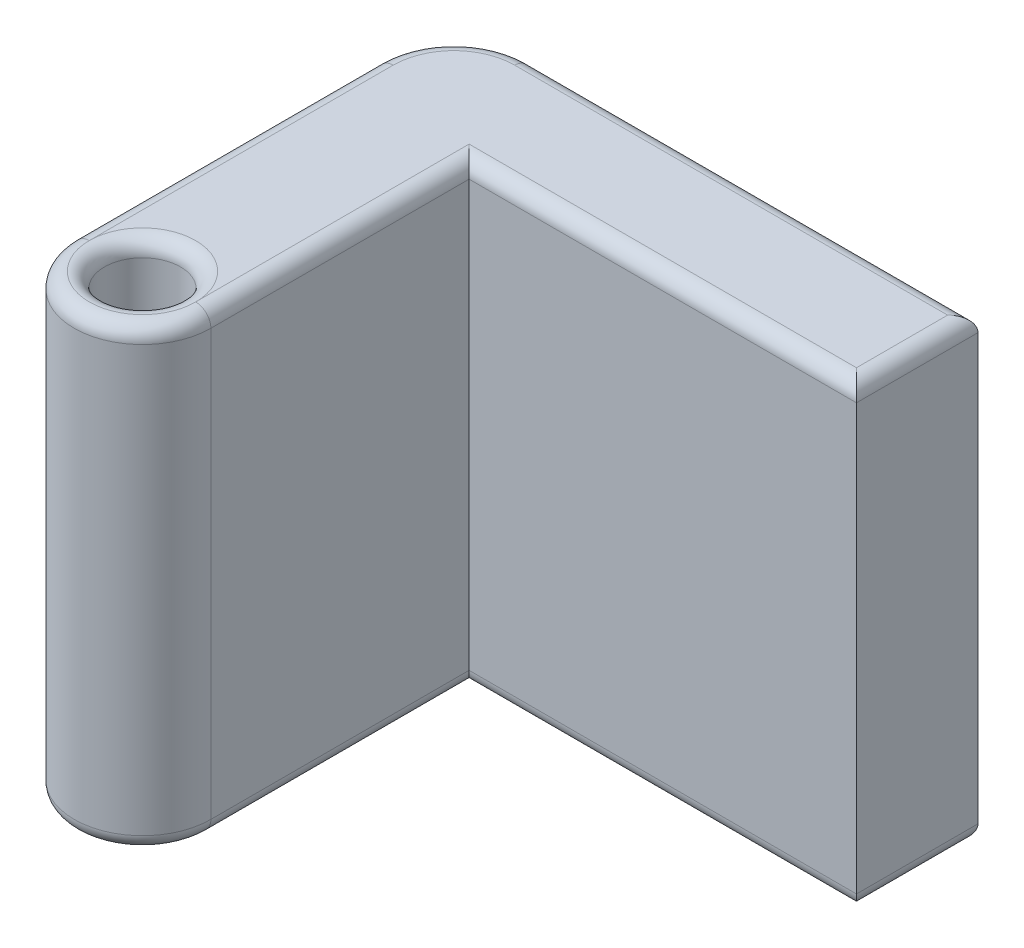
ISO-10303-21;
HEADER;
FILE_DESCRIPTION(('STEP AP214'),'2;1');
FILE_NAME('part.step','',(''),(''),'','','');
FILE_SCHEMA(('AUTOMOTIVE_DESIGN { 1 0 10303 214 1 1 1 1 }'));
ENDSEC;
DATA;
#1=APPLICATION_CONTEXT('core data for automotive mechanical design processes');
#2=APPLICATION_PROTOCOL_DEFINITION('international standard','automotive_design',2000,#1);
#3=PRODUCT_CONTEXT('',#1,'mechanical');
#4=PRODUCT('Part','Part','',(#3));
#5=PRODUCT_RELATED_PRODUCT_CATEGORY('part','',(#4));
#6=PRODUCT_DEFINITION_FORMATION('','',#4);
#7=PRODUCT_DEFINITION_CONTEXT('part definition',#1,'design');
#8=PRODUCT_DEFINITION('design','',#6,#7);
#9=PRODUCT_DEFINITION_SHAPE('','',#8);
#10=(LENGTH_UNIT() NAMED_UNIT(*) SI_UNIT(.MILLI.,.METRE.));
#11=(NAMED_UNIT(*) PLANE_ANGLE_UNIT() SI_UNIT($,.RADIAN.));
#12=(NAMED_UNIT(*) SI_UNIT($,.STERADIAN.) SOLID_ANGLE_UNIT());
#13=UNCERTAINTY_MEASURE_WITH_UNIT(LENGTH_MEASURE(1.E-05),#10,'distance_accuracy_value','');
#14=(GEOMETRIC_REPRESENTATION_CONTEXT(3) GLOBAL_UNCERTAINTY_ASSIGNED_CONTEXT((#13)) GLOBAL_UNIT_ASSIGNED_CONTEXT((#10,
#11,#12)) REPRESENTATION_CONTEXT('',''));
#15=CARTESIAN_POINT('',(0.,0.,0.));
#16=DIRECTION('',(0.,0.,1.));
#17=DIRECTION('',(1.,0.,0.));
#18=AXIS2_PLACEMENT_3D('',#15,#16,#17);
#19=CARTESIAN_POINT('',(-30.,30.,25.));
#20=DIRECTION('',(0.,1.,0.));
#21=DIRECTION('',(0.,0.,1.));
#22=AXIS2_PLACEMENT_3D('',#19,#20,#21);
#23=PLANE('',#22);
#24=CARTESIAN_POINT('',(-29.5,30.,5.));
#25=DIRECTION('',(0.,1.,0.));
#26=DIRECTION('',(0.,0.,1.));
#27=AXIS2_PLACEMENT_3D('',#24,#25,#26);
#28=CIRCLE('',#27,4.);
#29=CARTESIAN_POINT('',(-33.5,30.,5.));
#30=VERTEX_POINT('',#29);
#31=CARTESIAN_POINT('',(-29.5,30.,1.));
#32=VERTEX_POINT('',#31);
#33=EDGE_CURVE('E218',#30,#32,#28,.F.);
#34=ORIENTED_EDGE('',*,*,#33,.F.);
#35=DIRECTION('',(0.,0.,1.));
#36=VECTOR('',#35,1.);
#37=CARTESIAN_POINT('',(-33.5,30.,25.));
#38=LINE('',#37,#36);
#39=CARTESIAN_POINT('',(-33.5,30.,25.));
#40=VERTEX_POINT('',#39);
#41=EDGE_CURVE('E254',#30,#40,#38,.T.);
#42=ORIENTED_EDGE('',*,*,#41,.T.);
#43=CARTESIAN_POINT('',(-30.,30.,25.));
#44=DIRECTION('',(0.,1.,0.));
#45=DIRECTION('',(0.,0.,1.));
#46=AXIS2_PLACEMENT_3D('',#43,#44,#45);
#47=CIRCLE('',#46,3.5);
#48=CARTESIAN_POINT('',(-26.5,30.,25.));
#49=VERTEX_POINT('',#48);
#50=EDGE_CURVE('E266',#40,#49,#47,.F.);
#51=ORIENTED_EDGE('',*,*,#50,.T.);
#52=DIRECTION('',(0.,0.,-1.));
#53=VECTOR('',#52,1.);
#54=CARTESIAN_POINT('',(-26.5,30.,8.));
#55=LINE('',#54,#53);
#56=CARTESIAN_POINT('',(-26.5,30.,7.));
#57=VERTEX_POINT('',#56);
#58=EDGE_CURVE('E212',#49,#57,#55,.T.);
#59=ORIENTED_EDGE('',*,*,#58,.T.);
#60=DIRECTION('',(1.,0.,0.));
#61=VECTOR('',#60,1.);
#62=CARTESIAN_POINT('',(0.,30.,7.));
#63=LINE('',#62,#61);
#64=CARTESIAN_POINT('',(-1.,30.,7.));
#65=VERTEX_POINT('',#64);
#66=EDGE_CURVE('E258',#57,#65,#63,.T.);
#67=ORIENTED_EDGE('',*,*,#66,.T.);
#68=DIRECTION('',(0.,0.,-1.));
#69=VECTOR('',#68,1.);
#70=CARTESIAN_POINT('',(-1.,30.,0.));
#71=LINE('',#70,#69);
#72=CARTESIAN_POINT('',(-1.,30.,1.));
#73=VERTEX_POINT('',#72);
#74=EDGE_CURVE('E251',#65,#73,#71,.T.);
#75=ORIENTED_EDGE('',*,*,#74,.T.);
#76=DIRECTION('',(-1.,0.,0.));
#77=VECTOR('',#76,1.);
#78=CARTESIAN_POINT('',(-34.5,30.,1.00000000000001));
#79=LINE('',#78,#77);
#80=EDGE_CURVE('E247',#73,#32,#79,.T.);
#81=ORIENTED_EDGE('',*,*,#80,.T.);
#82=EDGE_LOOP('',(#34,#42,#51,#59,#67,#75,#81));
#83=FACE_BOUND('',#82,.T.);
#84=ADVANCED_FACE('F41',(#83),#23,.T.);
#85=CARTESIAN_POINT('',(-30.,0.,25.));
#86=DIRECTION('',(0.,1.,0.));
#87=DIRECTION('',(0.,0.,1.));
#88=AXIS2_PLACEMENT_3D('',#85,#86,#87);
#89=PLANE('',#88);
#90=CARTESIAN_POINT('',(-29.5,0.,5.));
#91=DIRECTION('',(0.,1.,0.));
#92=DIRECTION('',(0.,0.,1.));
#93=AXIS2_PLACEMENT_3D('',#90,#91,#92);
#94=CIRCLE('',#93,4.);
#95=CARTESIAN_POINT('',(-29.5,0.,1.));
#96=VERTEX_POINT('',#95);
#97=CARTESIAN_POINT('',(-33.5,0.,5.));
#98=VERTEX_POINT('',#97);
#99=EDGE_CURVE('E153',#96,#98,#94,.T.);
#100=ORIENTED_EDGE('',*,*,#99,.F.);
#101=DIRECTION('',(-1.,0.,0.));
#102=VECTOR('',#101,1.);
#103=CARTESIAN_POINT('',(-30.,0.,1.));
#104=LINE('',#103,#102);
#105=CARTESIAN_POINT('',(-1.,0.,1.));
#106=VERTEX_POINT('',#105);
#107=EDGE_CURVE('E146',#96,#106,#104,.F.);
#108=ORIENTED_EDGE('',*,*,#107,.T.);
#109=DIRECTION('',(0.,0.,-1.));
#110=VECTOR('',#109,1.);
#111=CARTESIAN_POINT('',(-1.,0.,25.));
#112=LINE('',#111,#110);
#113=CARTESIAN_POINT('',(-1.,0.,7.));
#114=VERTEX_POINT('',#113);
#115=EDGE_CURVE('E149',#106,#114,#112,.F.);
#116=ORIENTED_EDGE('',*,*,#115,.T.);
#117=DIRECTION('',(1.,0.,0.));
#118=VECTOR('',#117,1.);
#119=CARTESIAN_POINT('',(-30.,0.,7.));
#120=LINE('',#119,#118);
#121=CARTESIAN_POINT('',(-26.5,0.,7.));
#122=VERTEX_POINT('',#121);
#123=EDGE_CURVE('E168',#114,#122,#120,.F.);
#124=ORIENTED_EDGE('',*,*,#123,.T.);
#125=DIRECTION('',(0.,0.,-1.));
#126=VECTOR('',#125,1.);
#127=CARTESIAN_POINT('',(-26.5,0.,25.));
#128=LINE('',#127,#126);
#129=CARTESIAN_POINT('',(-26.5,0.,25.));
#130=VERTEX_POINT('',#129);
#131=EDGE_CURVE('E157',#122,#130,#128,.F.);
#132=ORIENTED_EDGE('',*,*,#131,.T.);
#133=CARTESIAN_POINT('',(-30.,0.,25.));
#134=DIRECTION('',(0.,1.,0.));
#135=DIRECTION('',(0.,0.,1.));
#136=AXIS2_PLACEMENT_3D('',#133,#134,#135);
#137=CIRCLE('',#136,3.5);
#138=CARTESIAN_POINT('',(-33.5,0.,25.));
#139=VERTEX_POINT('',#138);
#140=EDGE_CURVE('E156',#130,#139,#137,.T.);
#141=ORIENTED_EDGE('',*,*,#140,.T.);
#142=DIRECTION('',(0.,0.,1.));
#143=VECTOR('',#142,1.);
#144=CARTESIAN_POINT('',(-33.5,0.,25.));
#145=LINE('',#144,#143);
#146=EDGE_CURVE('E331',#139,#98,#145,.F.);
#147=ORIENTED_EDGE('',*,*,#146,.T.);
#148=EDGE_LOOP('',(#100,#108,#116,#124,#132,#141,#147));
#149=FACE_BOUND('',#148,.T.);
#150=ADVANCED_FACE('F148',(#149),#89,.F.);
#151=CARTESIAN_POINT('',(0.,30.,8.));
#152=DIRECTION('',(-1.,0.,0.));
#153=DIRECTION('',(0.,0.,1.));
#154=AXIS2_PLACEMENT_3D('',#151,#152,#153);
#155=PLANE('',#154);
#156=DIRECTION('',(0.,-1.,0.));
#157=VECTOR('',#156,1.);
#158=CARTESIAN_POINT('',(0.,30.,8.));
#159=LINE('',#158,#157);
#160=CARTESIAN_POINT('',(0.,29.,8.));
#161=VERTEX_POINT('',#160);
#162=CARTESIAN_POINT('',(0.,1.,8.));
#163=VERTEX_POINT('',#162);
#164=EDGE_CURVE('E174',#161,#163,#159,.T.);
#165=ORIENTED_EDGE('',*,*,#164,.T.);
#166=DIRECTION('',(0.,0.,-1.));
#167=VECTOR('',#166,1.);
#168=CARTESIAN_POINT('',(0.,1.,8.));
#169=LINE('',#168,#167);
#170=CARTESIAN_POINT('',(0.,1.,0.));
#171=VERTEX_POINT('',#170);
#172=EDGE_CURVE('E260',#163,#171,#169,.T.);
#173=ORIENTED_EDGE('',*,*,#172,.T.);
#174=DIRECTION('',(0.,-1.,0.));
#175=VECTOR('',#174,1.);
#176=CARTESIAN_POINT('',(0.,30.,0.));
#177=LINE('',#176,#175);
#178=CARTESIAN_POINT('',(0.,29.,0.));
#179=VERTEX_POINT('',#178);
#180=EDGE_CURVE('E169',#179,#171,#177,.T.);
#181=ORIENTED_EDGE('',*,*,#180,.F.);
#182=DIRECTION('',(0.,0.,-1.));
#183=VECTOR('',#182,1.);
#184=CARTESIAN_POINT('',(0.,29.,8.));
#185=LINE('',#184,#183);
#186=EDGE_CURVE('E298',#179,#161,#185,.F.);
#187=ORIENTED_EDGE('',*,*,#186,.T.);
#188=EDGE_LOOP('',(#165,#173,#181,#187));
#189=FACE_BOUND('',#188,.T.);
#190=ADVANCED_FACE('F311',(#189),#155,.F.);
#191=CARTESIAN_POINT('',(0.,30.,0.));
#192=DIRECTION('',(0.,0.,1.));
#193=DIRECTION('',(1.,0.,0.));
#194=AXIS2_PLACEMENT_3D('',#191,#192,#193);
#195=PLANE('',#194);
#196=DIRECTION('',(-1.,0.,0.));
#197=VECTOR('',#196,1.);
#198=CARTESIAN_POINT('',(0.,1.,0.));
#199=LINE('',#198,#197);
#200=CARTESIAN_POINT('',(-29.5,1.,0.));
#201=VERTEX_POINT('',#200);
#202=EDGE_CURVE('E172',#171,#201,#199,.T.);
#203=ORIENTED_EDGE('',*,*,#202,.T.);
#204=DIRECTION('',(0.,-1.,0.));
#205=VECTOR('',#204,1.);
#206=CARTESIAN_POINT('',(-29.5,30.,0.));
#207=LINE('',#206,#205);
#208=CARTESIAN_POINT('',(-29.5,29.,0.));
#209=VERTEX_POINT('',#208);
#210=EDGE_CURVE('E11',#201,#209,#207,.F.);
#211=ORIENTED_EDGE('',*,*,#210,.T.);
#212=DIRECTION('',(-1.,0.,0.));
#213=VECTOR('',#212,1.);
#214=CARTESIAN_POINT('',(0.,29.,0.));
#215=LINE('',#214,#213);
#216=EDGE_CURVE('E248',#209,#179,#215,.F.);
#217=ORIENTED_EDGE('',*,*,#216,.T.);
#218=ORIENTED_EDGE('',*,*,#180,.T.);
#219=EDGE_LOOP('',(#203,#211,#217,#218));
#220=FACE_BOUND('',#219,.T.);
#221=ADVANCED_FACE('F314',(#220),#195,.F.);
#222=CARTESIAN_POINT('',(-34.5,30.,0.));
#223=DIRECTION('',(1.,0.,0.));
#224=DIRECTION('',(0.,0.,-1.));
#225=AXIS2_PLACEMENT_3D('',#222,#223,#224);
#226=PLANE('',#225);
#227=DIRECTION('',(0.,0.,1.));
#228=VECTOR('',#227,1.);
#229=CARTESIAN_POINT('',(-34.5,29.,0.));
#230=LINE('',#229,#228);
#231=CARTESIAN_POINT('',(-34.5,29.,25.));
#232=VERTEX_POINT('',#231);
#233=CARTESIAN_POINT('',(-34.5,29.,5.));
#234=VERTEX_POINT('',#233);
#235=EDGE_CURVE('E346',#232,#234,#230,.F.);
#236=ORIENTED_EDGE('',*,*,#235,.T.);
#237=DIRECTION('',(0.,-1.,0.));
#238=VECTOR('',#237,1.);
#239=CARTESIAN_POINT('',(-34.5,30.,5.));
#240=LINE('',#239,#238);
#241=CARTESIAN_POINT('',(-34.5,1.,5.));
#242=VERTEX_POINT('',#241);
#243=EDGE_CURVE('E51',#234,#242,#240,.T.);
#244=ORIENTED_EDGE('',*,*,#243,.T.);
#245=DIRECTION('',(0.,0.,1.));
#246=VECTOR('',#245,1.);
#247=CARTESIAN_POINT('',(-34.5,1.,0.));
#248=LINE('',#247,#246);
#249=CARTESIAN_POINT('',(-34.5,1.,25.));
#250=VERTEX_POINT('',#249);
#251=EDGE_CURVE('E349',#242,#250,#248,.T.);
#252=ORIENTED_EDGE('',*,*,#251,.T.);
#253=DIRECTION('',(0.,-1.,0.));
#254=VECTOR('',#253,1.);
#255=CARTESIAN_POINT('',(-34.5,30.,25.));
#256=LINE('',#255,#254);
#257=EDGE_CURVE('E316',#232,#250,#256,.T.);
#258=ORIENTED_EDGE('',*,*,#257,.F.);
#259=EDGE_LOOP('',(#236,#244,#252,#258));
#260=FACE_BOUND('',#259,.T.);
#261=ADVANCED_FACE('F398',(#260),#226,.F.);
#262=CARTESIAN_POINT('',(-30.,30.,25.));
#263=DIRECTION('',(0.,-1.,0.));
#264=DIRECTION('',(0.,0.,-1.));
#265=AXIS2_PLACEMENT_3D('',#262,#263,#264);
#266=CYLINDRICAL_SURFACE('',#265,4.5);
#267=ORIENTED_EDGE('',*,*,#257,.T.);
#268=CARTESIAN_POINT('',(-30.,1.,25.));
#269=DIRECTION('',(0.,1.,0.));
#270=DIRECTION('',(0.,0.,1.));
#271=AXIS2_PLACEMENT_3D('',#268,#269,#270);
#272=CIRCLE('',#271,4.5);
#273=CARTESIAN_POINT('',(-25.5,1.,25.));
#274=VERTEX_POINT('',#273);
#275=EDGE_CURVE('E355',#250,#274,#272,.T.);
#276=ORIENTED_EDGE('',*,*,#275,.T.);
#277=DIRECTION('',(0.,-1.,0.));
#278=VECTOR('',#277,1.);
#279=CARTESIAN_POINT('',(-25.5,30.,25.));
#280=LINE('',#279,#278);
#281=CARTESIAN_POINT('',(-25.5,29.,25.));
#282=VERTEX_POINT('',#281);
#283=EDGE_CURVE('E320',#282,#274,#280,.T.);
#284=ORIENTED_EDGE('',*,*,#283,.F.);
#285=CARTESIAN_POINT('',(-30.,29.,25.));
#286=DIRECTION('',(0.,1.,0.));
#287=DIRECTION('',(0.,0.,1.));
#288=AXIS2_PLACEMENT_3D('',#285,#286,#287);
#289=CIRCLE('',#288,4.5);
#290=EDGE_CURVE('E352',#282,#232,#289,.F.);
#291=ORIENTED_EDGE('',*,*,#290,.T.);
#292=EDGE_LOOP('',(#267,#276,#284,#291));
#293=FACE_BOUND('',#292,.T.);
#294=ADVANCED_FACE('F382',(#293),#266,.T.);
#295=CARTESIAN_POINT('',(-25.5,30.,25.));
#296=DIRECTION('',(-1.,0.,0.));
#297=DIRECTION('',(0.,0.,1.));
#298=AXIS2_PLACEMENT_3D('',#295,#296,#297);
#299=PLANE('',#298);
#300=ORIENTED_EDGE('',*,*,#283,.T.);
#301=DIRECTION('',(0.,0.,-1.));
#302=VECTOR('',#301,1.);
#303=CARTESIAN_POINT('',(-25.5,1.,25.));
#304=LINE('',#303,#302);
#305=CARTESIAN_POINT('',(-25.5,1.,8.));
#306=VERTEX_POINT('',#305);
#307=EDGE_CURVE('E289',#274,#306,#304,.T.);
#308=ORIENTED_EDGE('',*,*,#307,.T.);
#309=DIRECTION('',(0.,-1.,0.));
#310=VECTOR('',#309,1.);
#311=CARTESIAN_POINT('',(-25.5,30.,8.));
#312=LINE('',#311,#310);
#313=CARTESIAN_POINT('',(-25.5,29.,8.));
#314=VERTEX_POINT('',#313);
#315=EDGE_CURVE('E179',#314,#306,#312,.T.);
#316=ORIENTED_EDGE('',*,*,#315,.F.);
#317=DIRECTION('',(0.,0.,-1.));
#318=VECTOR('',#317,1.);
#319=CARTESIAN_POINT('',(-25.5,29.,25.));
#320=LINE('',#319,#318);
#321=EDGE_CURVE('E358',#314,#282,#320,.F.);
#322=ORIENTED_EDGE('',*,*,#321,.T.);
#323=EDGE_LOOP('',(#300,#308,#316,#322));
#324=FACE_BOUND('',#323,.T.);
#325=ADVANCED_FACE('F364',(#324),#299,.F.);
#326=CARTESIAN_POINT('',(-25.5,30.,8.));
#327=DIRECTION('',(0.,0.,-1.));
#328=DIRECTION('',(-1.,0.,0.));
#329=AXIS2_PLACEMENT_3D('',#326,#327,#328);
#330=PLANE('',#329);
#331=ORIENTED_EDGE('',*,*,#315,.T.);
#332=DIRECTION('',(1.,0.,0.));
#333=VECTOR('',#332,1.);
#334=CARTESIAN_POINT('',(-25.5,1.,8.));
#335=LINE('',#334,#333);
#336=EDGE_CURVE('E293',#306,#163,#335,.T.);
#337=ORIENTED_EDGE('',*,*,#336,.T.);
#338=ORIENTED_EDGE('',*,*,#164,.F.);
#339=DIRECTION('',(1.,0.,0.));
#340=VECTOR('',#339,1.);
#341=CARTESIAN_POINT('',(-25.5,29.,8.));
#342=LINE('',#341,#340);
#343=EDGE_CURVE('E299',#161,#314,#342,.F.);
#344=ORIENTED_EDGE('',*,*,#343,.T.);
#345=EDGE_LOOP('',(#331,#337,#338,#344));
#346=FACE_BOUND('',#345,.T.);
#347=ADVANCED_FACE('F366',(#346),#330,.F.);
#348=CARTESIAN_POINT('',(-30.,30.,25.));
#349=DIRECTION('',(0.,-1.,0.));
#350=DIRECTION('',(0.,0.,-1.));
#351=AXIS2_PLACEMENT_3D('',#348,#349,#350);
#352=CYLINDRICAL_SURFACE('',#351,2.5);
#353=CARTESIAN_POINT('',(-30.,1.,25.));
#354=DIRECTION('',(0.,1.,0.));
#355=DIRECTION('',(0.,0.,1.));
#356=AXIS2_PLACEMENT_3D('',#353,#354,#355);
#357=CIRCLE('',#356,2.5);
#358=CARTESIAN_POINT('',(-30.,1.,27.5));
#359=VERTEX_POINT('',#358);
#360=EDGE_CURVE('E338',#359,#359,#357,.F.);
#361=ORIENTED_EDGE('',*,*,#360,.T.);
#362=EDGE_LOOP('',(#361));
#363=FACE_BOUND('',#362,.T.);
#364=CARTESIAN_POINT('',(-30.,29.,25.));
#365=DIRECTION('',(0.,1.,0.));
#366=DIRECTION('',(0.,0.,1.));
#367=AXIS2_PLACEMENT_3D('',#364,#365,#366);
#368=CIRCLE('',#367,2.5);
#369=CARTESIAN_POINT('',(-30.,29.,27.5));
#370=VERTEX_POINT('',#369);
#371=EDGE_CURVE('E334',#370,#370,#368,.T.);
#372=ORIENTED_EDGE('',*,*,#371,.T.);
#373=EDGE_LOOP('',(#372));
#374=FACE_BOUND('',#373,.T.);
#375=ADVANCED_FACE('F427',(#363,#374),#352,.F.);
#376=CARTESIAN_POINT('',(-1.,1.,8.));
#377=DIRECTION('',(0.,0.,-1.));
#378=DIRECTION('',(-1.,0.,0.));
#379=AXIS2_PLACEMENT_3D('',#376,#377,#378);
#380=CYLINDRICAL_SURFACE('',#379,1.);
#381=CARTESIAN_POINT('',(-1.,1.,7.));
#382=DIRECTION('',(0.707106781186547,0.,-0.707106781186547));
#383=DIRECTION('',(-0.707106781186547,0.,-0.707106781186547));
#384=AXIS2_PLACEMENT_3D('',#381,#382,#383);
#385=ELLIPSE('',#384,1.41421356237309,1.);
#386=EDGE_CURVE('E165',#114,#163,#385,.F.);
#387=ORIENTED_EDGE('',*,*,#386,.F.);
#388=ORIENTED_EDGE('',*,*,#115,.F.);
#389=CARTESIAN_POINT('',(-1.,1.,1.));
#390=DIRECTION('',(-0.707106781186548,0.,-0.707106781186547));
#391=DIRECTION('',(0.707106781186547,0.,-0.707106781186548));
#392=AXIS2_PLACEMENT_3D('',#389,#390,#391);
#393=ELLIPSE('',#392,1.4142135623731,1.);
#394=EDGE_CURVE('E163',#171,#106,#393,.T.);
#395=ORIENTED_EDGE('',*,*,#394,.F.);
#396=ORIENTED_EDGE('',*,*,#172,.F.);
#397=EDGE_LOOP('',(#387,#388,#395,#396));
#398=FACE_BOUND('',#397,.T.);
#399=ADVANCED_FACE('F161',(#398),#380,.T.);
#400=CARTESIAN_POINT('',(0.,1.,1.));
#401=DIRECTION('',(-1.,0.,0.));
#402=DIRECTION('',(0.,0.,1.));
#403=AXIS2_PLACEMENT_3D('',#400,#401,#402);
#404=CYLINDRICAL_SURFACE('',#403,1.);
#405=ORIENTED_EDGE('',*,*,#107,.F.);
#406=CARTESIAN_POINT('',(-29.5,1.,1.));
#407=DIRECTION('',(1.,0.,0.));
#408=DIRECTION('',(0.,0.,-1.));
#409=AXIS2_PLACEMENT_3D('',#406,#407,#408);
#410=CIRCLE('',#409,1.);
#411=EDGE_CURVE('E59',#96,#201,#410,.T.);
#412=ORIENTED_EDGE('',*,*,#411,.T.);
#413=ORIENTED_EDGE('',*,*,#202,.F.);
#414=ORIENTED_EDGE('',*,*,#394,.T.);
#415=EDGE_LOOP('',(#405,#412,#413,#414));
#416=FACE_BOUND('',#415,.T.);
#417=ADVANCED_FACE('F171',(#416),#404,.T.);
#418=CARTESIAN_POINT('',(-25.5,1.,7.));
#419=DIRECTION('',(1.,0.,0.));
#420=DIRECTION('',(0.,0.,-1.));
#421=AXIS2_PLACEMENT_3D('',#418,#419,#420);
#422=CYLINDRICAL_SURFACE('',#421,1.);
#423=ORIENTED_EDGE('',*,*,#386,.T.);
#424=ORIENTED_EDGE('',*,*,#336,.F.);
#425=CARTESIAN_POINT('',(-26.5,1.,7.));
#426=DIRECTION('',(0.707106781186547,0.,-0.707106781186547));
#427=DIRECTION('',(-0.707106781186547,0.,-0.707106781186547));
#428=AXIS2_PLACEMENT_3D('',#425,#426,#427);
#429=ELLIPSE('',#428,1.41421356237309,1.);
#430=EDGE_CURVE('E181',#122,#306,#429,.F.);
#431=ORIENTED_EDGE('',*,*,#430,.F.);
#432=ORIENTED_EDGE('',*,*,#123,.F.);
#433=EDGE_LOOP('',(#423,#424,#431,#432));
#434=FACE_BOUND('',#433,.T.);
#435=ADVANCED_FACE('F292',(#434),#422,.T.);
#436=CARTESIAN_POINT('',(-33.5,1.,0.));
#437=DIRECTION('',(0.,0.,1.));
#438=DIRECTION('',(1.,0.,0.));
#439=AXIS2_PLACEMENT_3D('',#436,#437,#438);
#440=CYLINDRICAL_SURFACE('',#439,1.);
#441=ORIENTED_EDGE('',*,*,#251,.F.);
#442=CARTESIAN_POINT('',(-33.5,1.,5.));
#443=DIRECTION('',(0.,0.,1.));
#444=DIRECTION('',(1.,0.,0.));
#445=AXIS2_PLACEMENT_3D('',#442,#443,#444);
#446=CIRCLE('',#445,1.);
#447=EDGE_CURVE('E211',#242,#98,#446,.T.);
#448=ORIENTED_EDGE('',*,*,#447,.T.);
#449=ORIENTED_EDGE('',*,*,#146,.F.);
#450=CARTESIAN_POINT('',(-33.5,1.,25.));
#451=DIRECTION('',(0.,0.,1.));
#452=DIRECTION('',(1.,0.,0.));
#453=AXIS2_PLACEMENT_3D('',#450,#451,#452);
#454=CIRCLE('',#453,1.);
#455=EDGE_CURVE('E278',#250,#139,#454,.T.);
#456=ORIENTED_EDGE('',*,*,#455,.F.);
#457=EDGE_LOOP('',(#441,#448,#449,#456));
#458=FACE_BOUND('',#457,.T.);
#459=ADVANCED_FACE('F396',(#458),#440,.T.);
#460=CARTESIAN_POINT('',(-26.5,1.,25.));
#461=DIRECTION('',(0.,0.,-1.));
#462=DIRECTION('',(-1.,0.,0.));
#463=AXIS2_PLACEMENT_3D('',#460,#461,#462);
#464=CYLINDRICAL_SURFACE('',#463,1.);
#465=ORIENTED_EDGE('',*,*,#430,.T.);
#466=ORIENTED_EDGE('',*,*,#307,.F.);
#467=CARTESIAN_POINT('',(-26.5,1.,25.));
#468=DIRECTION('',(0.,0.,1.));
#469=DIRECTION('',(1.,0.,0.));
#470=AXIS2_PLACEMENT_3D('',#467,#468,#469);
#471=CIRCLE('',#470,1.);
#472=EDGE_CURVE('E274',#130,#274,#471,.T.);
#473=ORIENTED_EDGE('',*,*,#472,.F.);
#474=ORIENTED_EDGE('',*,*,#131,.F.);
#475=EDGE_LOOP('',(#465,#466,#473,#474));
#476=FACE_BOUND('',#475,.T.);
#477=ADVANCED_FACE('F287',(#476),#464,.T.);
#478=CARTESIAN_POINT('',(-30.,1.,25.));
#479=DIRECTION('',(0.,1.,0.));
#480=DIRECTION('',(0.,0.,1.));
#481=AXIS2_PLACEMENT_3D('',#478,#479,#480);
#482=TOROIDAL_SURFACE('',#481,3.5,1.);
#483=CARTESIAN_POINT('',(-30.,0.,25.));
#484=DIRECTION('',(0.,1.,0.));
#485=DIRECTION('',(0.,0.,1.));
#486=AXIS2_PLACEMENT_3D('',#483,#484,#485);
#487=CIRCLE('',#486,3.5);
#488=EDGE_CURVE('E208',#130,#139,#487,.F.);
#489=ORIENTED_EDGE('',*,*,#488,.F.);
#490=ORIENTED_EDGE('',*,*,#472,.T.);
#491=ORIENTED_EDGE('',*,*,#275,.F.);
#492=ORIENTED_EDGE('',*,*,#455,.T.);
#493=EDGE_LOOP('',(#489,#490,#491,#492));
#494=FACE_BOUND('',#493,.T.);
#495=ADVANCED_FACE('F388',(#494),#482,.T.);
#496=CARTESIAN_POINT('',(-30.,1.,25.));
#497=DIRECTION('',(0.,1.,0.));
#498=DIRECTION('',(0.,0.,1.));
#499=AXIS2_PLACEMENT_3D('',#496,#497,#498);
#500=TOROIDAL_SURFACE('',#499,3.5,1.);
#501=ORIENTED_EDGE('',*,*,#360,.F.);
#502=EDGE_LOOP('',(#501));
#503=FACE_BOUND('',#502,.T.);
#504=ORIENTED_EDGE('',*,*,#140,.F.);
#505=ORIENTED_EDGE('',*,*,#488,.T.);
#506=EDGE_LOOP('',(#504,#505));
#507=FACE_BOUND('',#506,.T.);
#508=ADVANCED_FACE('F392',(#503,#507),#500,.T.);
#509=CARTESIAN_POINT('',(-1.,29.,25.));
#510=DIRECTION('',(0.,0.,1.));
#511=DIRECTION('',(1.,0.,0.));
#512=AXIS2_PLACEMENT_3D('',#509,#510,#511);
#513=CYLINDRICAL_SURFACE('',#512,1.);
#514=CARTESIAN_POINT('',(-1.,29.,1.));
#515=DIRECTION('',(0.707106781186548,0.,0.707106781186547));
#516=DIRECTION('',(-0.707106781186547,0.,0.707106781186548));
#517=AXIS2_PLACEMENT_3D('',#514,#515,#516);
#518=ELLIPSE('',#517,1.4142135623731,1.);
#519=EDGE_CURVE('E200',#73,#179,#518,.F.);
#520=ORIENTED_EDGE('',*,*,#519,.F.);
#521=ORIENTED_EDGE('',*,*,#74,.F.);
#522=CARTESIAN_POINT('',(-1.,29.,7.));
#523=DIRECTION('',(-0.707106781186547,0.,0.707106781186547));
#524=DIRECTION('',(0.707106781186547,0.,0.707106781186547));
#525=AXIS2_PLACEMENT_3D('',#522,#523,#524);
#526=ELLIPSE('',#525,1.41421356237309,1.);
#527=EDGE_CURVE('E204',#161,#65,#526,.T.);
#528=ORIENTED_EDGE('',*,*,#527,.F.);
#529=ORIENTED_EDGE('',*,*,#186,.F.);
#530=EDGE_LOOP('',(#520,#521,#528,#529));
#531=FACE_BOUND('',#530,.T.);
#532=ADVANCED_FACE('F409',(#531),#513,.T.);
#533=CARTESIAN_POINT('',(-30.,29.,7.));
#534=DIRECTION('',(-1.,0.,0.));
#535=DIRECTION('',(0.,0.,1.));
#536=AXIS2_PLACEMENT_3D('',#533,#534,#535);
#537=CYLINDRICAL_SURFACE('',#536,1.);
#538=ORIENTED_EDGE('',*,*,#527,.T.);
#539=ORIENTED_EDGE('',*,*,#66,.F.);
#540=CARTESIAN_POINT('',(-26.5,29.,7.));
#541=DIRECTION('',(-0.707106781186547,0.,0.707106781186547));
#542=DIRECTION('',(-0.707106781186547,0.,-0.707106781186547));
#543=AXIS2_PLACEMENT_3D('',#540,#541,#542);
#544=ELLIPSE('',#543,1.41421356237309,1.);
#545=EDGE_CURVE('E196',#314,#57,#544,.T.);
#546=ORIENTED_EDGE('',*,*,#545,.F.);
#547=ORIENTED_EDGE('',*,*,#343,.F.);
#548=EDGE_LOOP('',(#538,#539,#546,#547));
#549=FACE_BOUND('',#548,.T.);
#550=ADVANCED_FACE('F374',(#549),#537,.T.);
#551=CARTESIAN_POINT('',(-30.,29.,1.));
#552=DIRECTION('',(1.,0.,0.));
#553=DIRECTION('',(0.,0.,-1.));
#554=AXIS2_PLACEMENT_3D('',#551,#552,#553);
#555=CYLINDRICAL_SURFACE('',#554,1.);
#556=ORIENTED_EDGE('',*,*,#216,.F.);
#557=CARTESIAN_POINT('',(-29.5,29.,1.));
#558=DIRECTION('',(1.,0.,0.));
#559=DIRECTION('',(0.,0.,-1.));
#560=AXIS2_PLACEMENT_3D('',#557,#558,#559);
#561=CIRCLE('',#560,1.);
#562=EDGE_CURVE('E215',#209,#32,#561,.T.);
#563=ORIENTED_EDGE('',*,*,#562,.T.);
#564=ORIENTED_EDGE('',*,*,#80,.F.);
#565=ORIENTED_EDGE('',*,*,#519,.T.);
#566=EDGE_LOOP('',(#556,#563,#564,#565));
#567=FACE_BOUND('',#566,.T.);
#568=ADVANCED_FACE('F246',(#567),#555,.T.);
#569=CARTESIAN_POINT('',(-26.5,29.,25.));
#570=DIRECTION('',(0.,0.,1.));
#571=DIRECTION('',(1.,0.,0.));
#572=AXIS2_PLACEMENT_3D('',#569,#570,#571);
#573=CYLINDRICAL_SURFACE('',#572,1.);
#574=ORIENTED_EDGE('',*,*,#545,.T.);
#575=ORIENTED_EDGE('',*,*,#58,.F.);
#576=CARTESIAN_POINT('',(-26.5,29.,25.));
#577=DIRECTION('',(0.,0.,1.));
#578=DIRECTION('',(1.,0.,0.));
#579=AXIS2_PLACEMENT_3D('',#576,#577,#578);
#580=CIRCLE('',#579,1.);
#581=EDGE_CURVE('E192',#282,#49,#580,.T.);
#582=ORIENTED_EDGE('',*,*,#581,.F.);
#583=ORIENTED_EDGE('',*,*,#321,.F.);
#584=EDGE_LOOP('',(#574,#575,#582,#583));
#585=FACE_BOUND('',#584,.T.);
#586=ADVANCED_FACE('F378',(#585),#573,.T.);
#587=CARTESIAN_POINT('',(-33.5,29.,25.));
#588=DIRECTION('',(0.,0.,-1.));
#589=DIRECTION('',(-1.,0.,0.));
#590=AXIS2_PLACEMENT_3D('',#587,#588,#589);
#591=CYLINDRICAL_SURFACE('',#590,1.);
#592=ORIENTED_EDGE('',*,*,#41,.F.);
#593=CARTESIAN_POINT('',(-33.5,29.,5.));
#594=DIRECTION('',(0.,0.,1.));
#595=DIRECTION('',(1.,0.,0.));
#596=AXIS2_PLACEMENT_3D('',#593,#594,#595);
#597=CIRCLE('',#596,1.);
#598=EDGE_CURVE('E67',#30,#234,#597,.T.);
#599=ORIENTED_EDGE('',*,*,#598,.T.);
#600=ORIENTED_EDGE('',*,*,#235,.F.);
#601=CARTESIAN_POINT('',(-33.5,29.,25.));
#602=DIRECTION('',(0.,0.,1.));
#603=DIRECTION('',(1.,0.,0.));
#604=AXIS2_PLACEMENT_3D('',#601,#602,#603);
#605=CIRCLE('',#604,1.);
#606=EDGE_CURVE('E188',#40,#232,#605,.T.);
#607=ORIENTED_EDGE('',*,*,#606,.F.);
#608=EDGE_LOOP('',(#592,#599,#600,#607));
#609=FACE_BOUND('',#608,.T.);
#610=ADVANCED_FACE('F400',(#609),#591,.T.);
#611=CARTESIAN_POINT('',(-30.,29.,25.));
#612=DIRECTION('',(0.,1.,0.));
#613=DIRECTION('',(0.,0.,1.));
#614=AXIS2_PLACEMENT_3D('',#611,#612,#613);
#615=TOROIDAL_SURFACE('',#614,3.5,1.);
#616=CARTESIAN_POINT('',(-30.,30.,25.));
#617=DIRECTION('',(0.,1.,0.));
#618=DIRECTION('',(0.,0.,1.));
#619=AXIS2_PLACEMENT_3D('',#616,#617,#618);
#620=CIRCLE('',#619,3.5);
#621=EDGE_CURVE('E185',#40,#49,#620,.T.);
#622=ORIENTED_EDGE('',*,*,#621,.F.);
#623=ORIENTED_EDGE('',*,*,#606,.T.);
#624=ORIENTED_EDGE('',*,*,#290,.F.);
#625=ORIENTED_EDGE('',*,*,#581,.T.);
#626=EDGE_LOOP('',(#622,#623,#624,#625));
#627=FACE_BOUND('',#626,.T.);
#628=ADVANCED_FACE('F403',(#627),#615,.T.);
#629=CARTESIAN_POINT('',(-30.,29.,25.));
#630=DIRECTION('',(0.,1.,0.));
#631=DIRECTION('',(0.,0.,1.));
#632=AXIS2_PLACEMENT_3D('',#629,#630,#631);
#633=TOROIDAL_SURFACE('',#632,3.5,1.);
#634=ORIENTED_EDGE('',*,*,#50,.F.);
#635=ORIENTED_EDGE('',*,*,#621,.T.);
#636=EDGE_LOOP('',(#634,#635));
#637=FACE_BOUND('',#636,.T.);
#638=ORIENTED_EDGE('',*,*,#371,.F.);
#639=EDGE_LOOP('',(#638));
#640=FACE_BOUND('',#639,.T.);
#641=ADVANCED_FACE('F406',(#637,#640),#633,.T.);
#642=CARTESIAN_POINT('',(-29.5,29.,5.));
#643=DIRECTION('',(0.,1.,0.));
#644=DIRECTION('',(0.,0.,1.));
#645=AXIS2_PLACEMENT_3D('',#642,#643,#644);
#646=TOROIDAL_SURFACE('',#645,4.,1.);
#647=ORIENTED_EDGE('',*,*,#33,.T.);
#648=ORIENTED_EDGE('',*,*,#562,.F.);
#649=CARTESIAN_POINT('',(-29.5,29.,5.));
#650=DIRECTION('',(0.,1.,0.));
#651=DIRECTION('',(0.,0.,1.));
#652=AXIS2_PLACEMENT_3D('',#649,#650,#651);
#653=CIRCLE('',#652,5.);
#654=EDGE_CURVE('E45',#234,#209,#653,.F.);
#655=ORIENTED_EDGE('',*,*,#654,.F.);
#656=ORIENTED_EDGE('',*,*,#598,.F.);
#657=EDGE_LOOP('',(#647,#648,#655,#656));
#658=FACE_BOUND('',#657,.T.);
#659=ADVANCED_FACE('F43',(#658),#646,.T.);
#660=CARTESIAN_POINT('',(-29.5,30.,5.));
#661=DIRECTION('',(0.,-1.,0.));
#662=DIRECTION('',(0.,0.,-1.));
#663=AXIS2_PLACEMENT_3D('',#660,#661,#662);
#664=CYLINDRICAL_SURFACE('',#663,5.);
#665=ORIENTED_EDGE('',*,*,#654,.T.);
#666=ORIENTED_EDGE('',*,*,#210,.F.);
#667=CARTESIAN_POINT('',(-29.5,1.,5.));
#668=DIRECTION('',(0.,1.,0.));
#669=DIRECTION('',(0.,0.,1.));
#670=AXIS2_PLACEMENT_3D('',#667,#668,#669);
#671=CIRCLE('',#670,5.);
#672=EDGE_CURVE('E227',#242,#201,#671,.F.);
#673=ORIENTED_EDGE('',*,*,#672,.F.);
#674=ORIENTED_EDGE('',*,*,#243,.F.);
#675=EDGE_LOOP('',(#665,#666,#673,#674));
#676=FACE_BOUND('',#675,.T.);
#677=ADVANCED_FACE('F239',(#676),#664,.T.);
#678=CARTESIAN_POINT('',(-29.5,1.,5.));
#679=DIRECTION('',(0.,1.,0.));
#680=DIRECTION('',(0.,0.,1.));
#681=AXIS2_PLACEMENT_3D('',#678,#679,#680);
#682=TOROIDAL_SURFACE('',#681,4.,1.);
#683=ORIENTED_EDGE('',*,*,#411,.F.);
#684=ORIENTED_EDGE('',*,*,#99,.T.);
#685=ORIENTED_EDGE('',*,*,#447,.F.);
#686=ORIENTED_EDGE('',*,*,#672,.T.);
#687=EDGE_LOOP('',(#683,#684,#685,#686));
#688=FACE_BOUND('',#687,.T.);
#689=ADVANCED_FACE('F394',(#688),#682,.T.);
#690=CLOSED_SHELL('',(#84,#150,#190,#221,#261,#294,#325,#347,#375,#399,#417,#435,#459,#477,#495,
#508,#532,#550,#568,#586,#610,#628,#641,#659,#677,#689));
#691=MANIFOLD_SOLID_BREP('B2',#690);
#692=ADVANCED_BREP_SHAPE_REPRESENTATION('',(#18,#691),#14);
#693=SHAPE_DEFINITION_REPRESENTATION(#9,#692);
ENDSEC;
END-ISO-10303-21;
